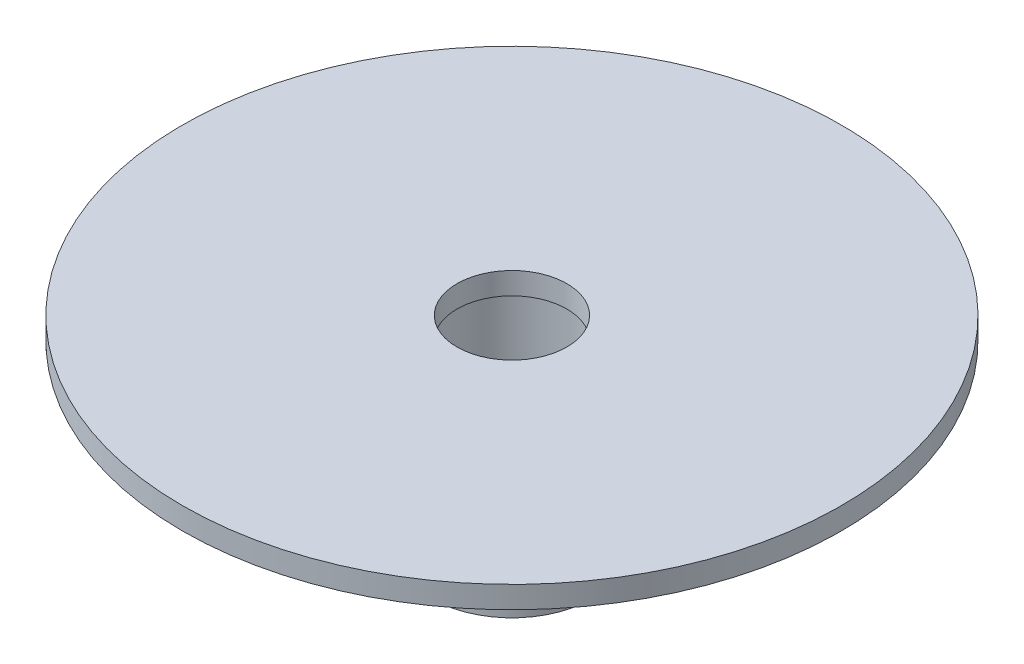
ISO-10303-21;
HEADER;
FILE_DESCRIPTION(('STEP AP214'),'2;1');
FILE_NAME('part.step','',(''),(''),'','','');
FILE_SCHEMA(('AUTOMOTIVE_DESIGN { 1 0 10303 214 1 1 1 1 }'));
ENDSEC;
DATA;
#1=APPLICATION_CONTEXT('core data for automotive mechanical design processes');
#2=APPLICATION_PROTOCOL_DEFINITION('international standard','automotive_design',2000,#1);
#3=PRODUCT_CONTEXT('',#1,'mechanical');
#4=PRODUCT('Part','Part','',(#3));
#5=PRODUCT_RELATED_PRODUCT_CATEGORY('part','',(#4));
#6=PRODUCT_DEFINITION_FORMATION('','',#4);
#7=PRODUCT_DEFINITION_CONTEXT('part definition',#1,'design');
#8=PRODUCT_DEFINITION('design','',#6,#7);
#9=PRODUCT_DEFINITION_SHAPE('','',#8);
#10=(LENGTH_UNIT() NAMED_UNIT(*) SI_UNIT(.MILLI.,.METRE.));
#11=(NAMED_UNIT(*) PLANE_ANGLE_UNIT() SI_UNIT($,.RADIAN.));
#12=(NAMED_UNIT(*) SI_UNIT($,.STERADIAN.) SOLID_ANGLE_UNIT());
#13=UNCERTAINTY_MEASURE_WITH_UNIT(LENGTH_MEASURE(1.E-05),#10,'distance_accuracy_value','');
#14=(GEOMETRIC_REPRESENTATION_CONTEXT(3) GLOBAL_UNCERTAINTY_ASSIGNED_CONTEXT((#13)) GLOBAL_UNIT_ASSIGNED_CONTEXT((#10,
#11,#12)) REPRESENTATION_CONTEXT('',''));
#15=CARTESIAN_POINT('',(0.,0.,0.));
#16=DIRECTION('',(0.,0.,1.));
#17=DIRECTION('',(1.,0.,0.));
#18=AXIS2_PLACEMENT_3D('',#15,#16,#17);
#19=CARTESIAN_POINT('',(0.,0.,0.));
#20=DIRECTION('',(0.,1.,0.));
#21=DIRECTION('',(0.,0.,1.));
#22=AXIS2_PLACEMENT_3D('',#19,#20,#21);
#23=PLANE('',#22);
#24=CARTESIAN_POINT('',(0.,0.,0.));
#25=DIRECTION('',(0.,1.,0.));
#26=DIRECTION('',(0.,0.,1.));
#27=AXIS2_PLACEMENT_3D('',#24,#25,#26);
#28=CIRCLE('',#27,7.5);
#29=CARTESIAN_POINT('',(0.,0.,7.5));
#30=VERTEX_POINT('',#29);
#31=EDGE_CURVE('E61',#30,#30,#28,.T.);
#32=ORIENTED_EDGE('',*,*,#31,.T.);
#33=EDGE_LOOP('',(#32));
#34=FACE_BOUND('',#33,.T.);
#35=CARTESIAN_POINT('',(0.,0.,0.));
#36=DIRECTION('',(0.,-1.,0.));
#37=DIRECTION('',(0.,0.,-1.));
#38=AXIS2_PLACEMENT_3D('',#35,#36,#37);
#39=CIRCLE('',#38,9.);
#40=CARTESIAN_POINT('',(0.,0.,-9.));
#41=VERTEX_POINT('',#40);
#42=EDGE_CURVE('E70',#41,#41,#39,.T.);
#43=ORIENTED_EDGE('',*,*,#42,.T.);
#44=EDGE_LOOP('',(#43));
#45=FACE_BOUND('',#44,.T.);
#46=ADVANCED_FACE('F43',(#34,#45),#23,.F.);
#47=CARTESIAN_POINT('',(0.,3.,0.));
#48=DIRECTION('',(0.,1.,0.));
#49=DIRECTION('',(0.,0.,1.));
#50=AXIS2_PLACEMENT_3D('',#47,#48,#49);
#51=PLANE('',#50);
#52=CARTESIAN_POINT('',(0.,3.,0.));
#53=DIRECTION('',(0.,1.,0.));
#54=DIRECTION('',(0.,0.,1.));
#55=AXIS2_PLACEMENT_3D('',#52,#53,#54);
#56=CIRCLE('',#55,45.);
#57=CARTESIAN_POINT('',(0.,3.,45.));
#58=VERTEX_POINT('',#57);
#59=EDGE_CURVE('E50',#58,#58,#56,.T.);
#60=ORIENTED_EDGE('',*,*,#59,.T.);
#61=EDGE_LOOP('',(#60));
#62=FACE_BOUND('',#61,.T.);
#63=CARTESIAN_POINT('',(0.,3.,0.));
#64=DIRECTION('',(0.,1.,0.));
#65=DIRECTION('',(0.,0.,1.));
#66=AXIS2_PLACEMENT_3D('',#63,#64,#65);
#67=CIRCLE('',#66,7.5);
#68=CARTESIAN_POINT('',(0.,3.,7.5));
#69=VERTEX_POINT('',#68);
#70=EDGE_CURVE('E59',#69,#69,#67,.T.);
#71=ORIENTED_EDGE('',*,*,#70,.F.);
#72=EDGE_LOOP('',(#71));
#73=FACE_BOUND('',#72,.T.);
#74=ADVANCED_FACE('F95',(#62,#73),#51,.T.);
#75=CARTESIAN_POINT('',(0.,0.,0.));
#76=DIRECTION('',(0.,1.,0.));
#77=DIRECTION('',(0.,0.,1.));
#78=AXIS2_PLACEMENT_3D('',#75,#76,#77);
#79=CIRCLE('',#78,11.);
#80=CARTESIAN_POINT('',(0.,0.,11.));
#81=VERTEX_POINT('',#80);
#82=EDGE_CURVE('E11',#81,#81,#79,.F.);
#83=ORIENTED_EDGE('',*,*,#82,.F.);
#84=EDGE_LOOP('',(#83));
#85=FACE_BOUND('',#84,.T.);
#86=CARTESIAN_POINT('',(0.,0.,0.));
#87=DIRECTION('',(0.,1.,0.));
#88=DIRECTION('',(0.,0.,1.));
#89=AXIS2_PLACEMENT_3D('',#86,#87,#88);
#90=CIRCLE('',#89,45.);
#91=CARTESIAN_POINT('',(0.,0.,45.));
#92=VERTEX_POINT('',#91);
#93=EDGE_CURVE('E54',#92,#92,#90,.T.);
#94=ORIENTED_EDGE('',*,*,#93,.F.);
#95=EDGE_LOOP('',(#94));
#96=FACE_BOUND('',#95,.T.);
#97=ADVANCED_FACE('F97',(#85,#96),#23,.F.);
#98=CARTESIAN_POINT('',(0.,3.,0.));
#99=DIRECTION('',(0.,-1.,0.));
#100=DIRECTION('',(0.,0.,-1.));
#101=AXIS2_PLACEMENT_3D('',#98,#99,#100);
#102=CYLINDRICAL_SURFACE('',#101,45.);
#103=ORIENTED_EDGE('',*,*,#59,.F.);
#104=EDGE_LOOP('',(#103));
#105=FACE_BOUND('',#104,.T.);
#106=ORIENTED_EDGE('',*,*,#93,.T.);
#107=EDGE_LOOP('',(#106));
#108=FACE_BOUND('',#107,.T.);
#109=ADVANCED_FACE('F45',(#105,#108),#102,.T.);
#110=CARTESIAN_POINT('',(0.,3.,0.));
#111=DIRECTION('',(0.,-1.,0.));
#112=DIRECTION('',(0.,0.,-1.));
#113=AXIS2_PLACEMENT_3D('',#110,#111,#112);
#114=CYLINDRICAL_SURFACE('',#113,7.5);
#115=ORIENTED_EDGE('',*,*,#70,.T.);
#116=EDGE_LOOP('',(#115));
#117=FACE_BOUND('',#116,.T.);
#118=ORIENTED_EDGE('',*,*,#31,.F.);
#119=EDGE_LOOP('',(#118));
#120=FACE_BOUND('',#119,.T.);
#121=ADVANCED_FACE('F82',(#117,#120),#114,.F.);
#122=CARTESIAN_POINT('',(0.,-25.,0.));
#123=DIRECTION('',(0.,-1.,0.));
#124=DIRECTION('',(0.,0.,-1.));
#125=AXIS2_PLACEMENT_3D('',#122,#123,#124);
#126=PLANE('',#125);
#127=CARTESIAN_POINT('',(0.,-25.,0.));
#128=DIRECTION('',(0.,-1.,0.));
#129=DIRECTION('',(0.,0.,-1.));
#130=AXIS2_PLACEMENT_3D('',#127,#128,#129);
#131=CIRCLE('',#130,11.);
#132=CARTESIAN_POINT('',(0.,-25.,-11.));
#133=VERTEX_POINT('',#132);
#134=EDGE_CURVE('E64',#133,#133,#131,.T.);
#135=ORIENTED_EDGE('',*,*,#134,.T.);
#136=EDGE_LOOP('',(#135));
#137=FACE_BOUND('',#136,.T.);
#138=CARTESIAN_POINT('',(0.,-25.,0.));
#139=DIRECTION('',(0.,-1.,0.));
#140=DIRECTION('',(0.,0.,-1.));
#141=AXIS2_PLACEMENT_3D('',#138,#139,#140);
#142=CIRCLE('',#141,9.);
#143=CARTESIAN_POINT('',(0.,-25.,-9.));
#144=VERTEX_POINT('',#143);
#145=EDGE_CURVE('E69',#144,#144,#142,.T.);
#146=ORIENTED_EDGE('',*,*,#145,.F.);
#147=EDGE_LOOP('',(#146));
#148=FACE_BOUND('',#147,.T.);
#149=ADVANCED_FACE('F79',(#137,#148),#126,.T.);
#150=CARTESIAN_POINT('',(0.,-25.,0.));
#151=DIRECTION('',(0.,1.,0.));
#152=DIRECTION('',(0.,0.,1.));
#153=AXIS2_PLACEMENT_3D('',#150,#151,#152);
#154=CYLINDRICAL_SURFACE('',#153,11.);
#155=ORIENTED_EDGE('',*,*,#134,.F.);
#156=EDGE_LOOP('',(#155));
#157=FACE_BOUND('',#156,.T.);
#158=ORIENTED_EDGE('',*,*,#82,.T.);
#159=EDGE_LOOP('',(#158));
#160=FACE_BOUND('',#159,.T.);
#161=ADVANCED_FACE('F81',(#157,#160),#154,.T.);
#162=CARTESIAN_POINT('',(0.,-25.,0.));
#163=DIRECTION('',(0.,1.,0.));
#164=DIRECTION('',(0.,0.,1.));
#165=AXIS2_PLACEMENT_3D('',#162,#163,#164);
#166=CYLINDRICAL_SURFACE('',#165,9.);
#167=ORIENTED_EDGE('',*,*,#145,.T.);
#168=EDGE_LOOP('',(#167));
#169=FACE_BOUND('',#168,.T.);
#170=ORIENTED_EDGE('',*,*,#42,.F.);
#171=EDGE_LOOP('',(#170));
#172=FACE_BOUND('',#171,.T.);
#173=ADVANCED_FACE('F76',(#169,#172),#166,.F.);
#174=CLOSED_SHELL('',(#46,#74,#97,#109,#121,#149,#161,#173));
#175=MANIFOLD_SOLID_BREP('B2',#174);
#176=ADVANCED_BREP_SHAPE_REPRESENTATION('',(#18,#175),#14);
#177=SHAPE_DEFINITION_REPRESENTATION(#9,#176);
ENDSEC;
END-ISO-10303-21;
